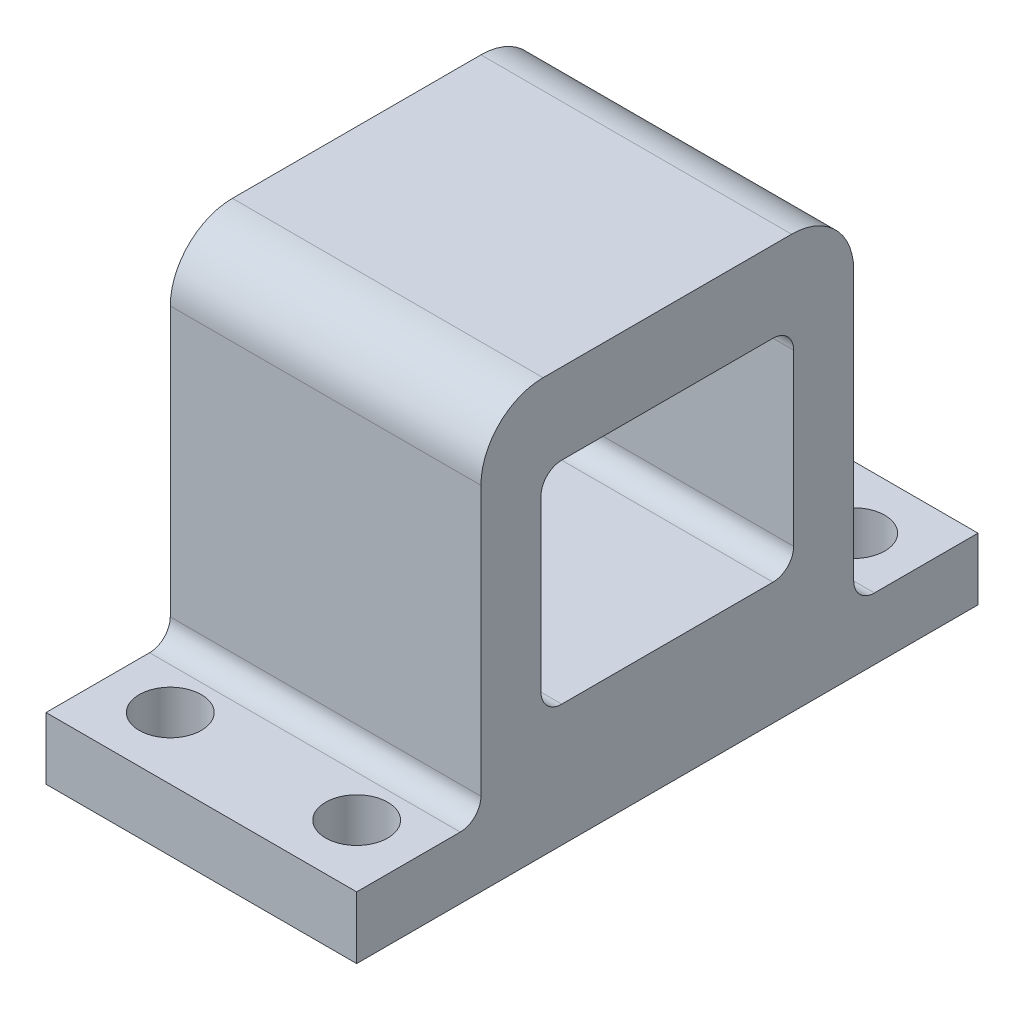
ISO-10303-21;
HEADER;
FILE_DESCRIPTION(('STEP AP214'),'2;1');
FILE_NAME('part.step','',(''),(''),'','','');
FILE_SCHEMA(('AUTOMOTIVE_DESIGN { 1 0 10303 214 1 1 1 1 }'));
ENDSEC;
DATA;
#1=APPLICATION_CONTEXT('core data for automotive mechanical design processes');
#2=APPLICATION_PROTOCOL_DEFINITION('international standard','automotive_design',2000,#1);
#3=PRODUCT_CONTEXT('',#1,'mechanical');
#4=PRODUCT('Part','Part','',(#3));
#5=PRODUCT_RELATED_PRODUCT_CATEGORY('part','',(#4));
#6=PRODUCT_DEFINITION_FORMATION('','',#4);
#7=PRODUCT_DEFINITION_CONTEXT('part definition',#1,'design');
#8=PRODUCT_DEFINITION('design','',#6,#7);
#9=PRODUCT_DEFINITION_SHAPE('','',#8);
#10=(LENGTH_UNIT() NAMED_UNIT(*) SI_UNIT(.MILLI.,.METRE.));
#11=(NAMED_UNIT(*) PLANE_ANGLE_UNIT() SI_UNIT($,.RADIAN.));
#12=(NAMED_UNIT(*) SI_UNIT($,.STERADIAN.) SOLID_ANGLE_UNIT());
#13=UNCERTAINTY_MEASURE_WITH_UNIT(LENGTH_MEASURE(1.E-05),#10,'distance_accuracy_value','');
#14=(GEOMETRIC_REPRESENTATION_CONTEXT(3) GLOBAL_UNCERTAINTY_ASSIGNED_CONTEXT((#13)) GLOBAL_UNIT_ASSIGNED_CONTEXT((#10,
#11,#12)) REPRESENTATION_CONTEXT('',''));
#15=CARTESIAN_POINT('',(0.,0.,0.));
#16=DIRECTION('',(0.,0.,1.));
#17=DIRECTION('',(1.,0.,0.));
#18=AXIS2_PLACEMENT_3D('',#15,#16,#17);
#19=CARTESIAN_POINT('',(0.,3.,0.));
#20=DIRECTION('',(0.,1.,0.));
#21=DIRECTION('',(0.,0.,1.));
#22=AXIS2_PLACEMENT_3D('',#19,#20,#21);
#23=PLANE('',#22);
#24=CARTESIAN_POINT('',(-12.,3.,-27.));
#25=DIRECTION('',(0.,1.,0.));
#26=DIRECTION('',(0.,0.,1.));
#27=AXIS2_PLACEMENT_3D('',#24,#25,#26);
#28=CIRCLE('',#27,1.5);
#29=CARTESIAN_POINT('',(-12.,3.,-25.5));
#30=VERTEX_POINT('',#29);
#31=EDGE_CURVE('E316',#30,#30,#28,.T.);
#32=ORIENTED_EDGE('',*,*,#31,.F.);
#33=EDGE_LOOP('',(#32));
#34=FACE_BOUND('',#33,.T.);
#35=CARTESIAN_POINT('',(-3.,3.,-27.));
#36=DIRECTION('',(0.,1.,0.));
#37=DIRECTION('',(0.,0.,1.));
#38=AXIS2_PLACEMENT_3D('',#35,#36,#37);
#39=CIRCLE('',#38,1.5);
#40=CARTESIAN_POINT('',(-3.,3.,-25.5));
#41=VERTEX_POINT('',#40);
#42=EDGE_CURVE('E317',#41,#41,#39,.T.);
#43=ORIENTED_EDGE('',*,*,#42,.F.);
#44=EDGE_LOOP('',(#43));
#45=FACE_BOUND('',#44,.T.);
#46=DIRECTION('',(0.,0.,1.));
#47=VECTOR('',#46,1.);
#48=CARTESIAN_POINT('',(-15.,3.,0.));
#49=LINE('',#48,#47);
#50=CARTESIAN_POINT('',(-15.,3.,-30.));
#51=VERTEX_POINT('',#50);
#52=CARTESIAN_POINT('',(-15.,3.,-25.));
#53=VERTEX_POINT('',#52);
#54=EDGE_CURVE('E337',#51,#53,#49,.T.);
#55=ORIENTED_EDGE('',*,*,#54,.T.);
#56=DIRECTION('',(1.,0.,0.));
#57=VECTOR('',#56,1.);
#58=CARTESIAN_POINT('',(0.,3.,-25.));
#59=LINE('',#58,#57);
#60=CARTESIAN_POINT('',(0.,3.,-25.));
#61=VERTEX_POINT('',#60);
#62=EDGE_CURVE('E180',#53,#61,#59,.T.);
#63=ORIENTED_EDGE('',*,*,#62,.T.);
#64=DIRECTION('',(0.,0.,-1.));
#65=VECTOR('',#64,1.);
#66=CARTESIAN_POINT('',(0.,3.,0.));
#67=LINE('',#66,#65);
#68=CARTESIAN_POINT('',(0.,3.,-30.));
#69=VERTEX_POINT('',#68);
#70=EDGE_CURVE('E174',#61,#69,#67,.T.);
#71=ORIENTED_EDGE('',*,*,#70,.T.);
#72=DIRECTION('',(-1.,0.,0.));
#73=VECTOR('',#72,1.);
#74=CARTESIAN_POINT('',(0.,3.,-30.));
#75=LINE('',#74,#73);
#76=EDGE_CURVE('E177',#69,#51,#75,.T.);
#77=ORIENTED_EDGE('',*,*,#76,.T.);
#78=EDGE_LOOP('',(#55,#63,#71,#77));
#79=FACE_BOUND('',#78,.T.);
#80=ADVANCED_FACE('F37',(#34,#45,#79),#23,.T.);
#81=CARTESIAN_POINT('',(0.,3.,0.));
#82=DIRECTION('',(-1.,0.,0.));
#83=DIRECTION('',(0.,0.,1.));
#84=AXIS2_PLACEMENT_3D('',#81,#82,#83);
#85=PLANE('',#84);
#86=DIRECTION('',(0.,0.,-1.));
#87=VECTOR('',#86,1.);
#88=CARTESIAN_POINT('',(0.,16.1,-8.9));
#89=LINE('',#88,#87);
#90=CARTESIAN_POINT('',(0.,16.1,-9.9));
#91=VERTEX_POINT('',#90);
#92=CARTESIAN_POINT('',(0.,16.1,-20.1));
#93=VERTEX_POINT('',#92);
#94=EDGE_CURVE('E288',#91,#93,#89,.T.);
#95=ORIENTED_EDGE('',*,*,#94,.T.);
#96=CARTESIAN_POINT('',(0.,15.1,-20.1));
#97=DIRECTION('',(-1.,0.,0.));
#98=DIRECTION('',(0.,0.,1.));
#99=AXIS2_PLACEMENT_3D('',#96,#97,#98);
#100=CIRCLE('',#99,1.);
#101=CARTESIAN_POINT('',(0.,15.1,-21.1));
#102=VERTEX_POINT('',#101);
#103=EDGE_CURVE('E269',#93,#102,#100,.T.);
#104=ORIENTED_EDGE('',*,*,#103,.T.);
#105=DIRECTION('',(0.,-1.,0.));
#106=VECTOR('',#105,1.);
#107=CARTESIAN_POINT('',(0.,16.1,-21.1));
#108=LINE('',#107,#106);
#109=CARTESIAN_POINT('',(0.,6.9,-21.1));
#110=VERTEX_POINT('',#109);
#111=EDGE_CURVE('E281',#102,#110,#108,.T.);
#112=ORIENTED_EDGE('',*,*,#111,.T.);
#113=CARTESIAN_POINT('',(0.,6.9,-20.1));
#114=DIRECTION('',(-1.,0.,0.));
#115=DIRECTION('',(0.,0.,1.));
#116=AXIS2_PLACEMENT_3D('',#113,#114,#115);
#117=CIRCLE('',#116,1.);
#118=CARTESIAN_POINT('',(0.,5.9,-20.1));
#119=VERTEX_POINT('',#118);
#120=EDGE_CURVE('E45',#110,#119,#117,.T.);
#121=ORIENTED_EDGE('',*,*,#120,.T.);
#122=DIRECTION('',(0.,0.,-1.));
#123=VECTOR('',#122,1.);
#124=CARTESIAN_POINT('',(0.,5.9,-8.9));
#125=LINE('',#124,#123);
#126=CARTESIAN_POINT('',(0.,5.9,-9.9));
#127=VERTEX_POINT('',#126);
#128=EDGE_CURVE('E289',#127,#119,#125,.T.);
#129=ORIENTED_EDGE('',*,*,#128,.F.);
#130=CARTESIAN_POINT('',(0.,6.9,-9.9));
#131=DIRECTION('',(-1.,0.,0.));
#132=DIRECTION('',(0.,0.,1.));
#133=AXIS2_PLACEMENT_3D('',#130,#131,#132);
#134=CIRCLE('',#133,1.);
#135=CARTESIAN_POINT('',(0.,6.9,-8.9));
#136=VERTEX_POINT('',#135);
#137=EDGE_CURVE('E250',#127,#136,#134,.T.);
#138=ORIENTED_EDGE('',*,*,#137,.T.);
#139=DIRECTION('',(0.,-1.,0.));
#140=VECTOR('',#139,1.);
#141=CARTESIAN_POINT('',(0.,16.1,-8.9));
#142=LINE('',#141,#140);
#143=CARTESIAN_POINT('',(0.,15.1,-8.9));
#144=VERTEX_POINT('',#143);
#145=EDGE_CURVE('E291',#144,#136,#142,.T.);
#146=ORIENTED_EDGE('',*,*,#145,.F.);
#147=CARTESIAN_POINT('',(0.,15.1,-9.9));
#148=DIRECTION('',(-1.,0.,0.));
#149=DIRECTION('',(0.,0.,1.));
#150=AXIS2_PLACEMENT_3D('',#147,#148,#149);
#151=CIRCLE('',#150,1.);
#152=EDGE_CURVE('E260',#144,#91,#151,.T.);
#153=ORIENTED_EDGE('',*,*,#152,.T.);
#154=EDGE_LOOP('',(#95,#104,#112,#121,#129,#138,#146,#153));
#155=FACE_BOUND('',#154,.T.);
#156=DIRECTION('',(0.,0.,-1.));
#157=VECTOR('',#156,1.);
#158=CARTESIAN_POINT('',(0.,20.,0.));
#159=LINE('',#158,#157);
#160=CARTESIAN_POINT('',(0.,20.,-9.));
#161=VERTEX_POINT('',#160);
#162=CARTESIAN_POINT('',(0.,20.,-21.));
#163=VERTEX_POINT('',#162);
#164=EDGE_CURVE('E301',#161,#163,#159,.T.);
#165=ORIENTED_EDGE('',*,*,#164,.F.);
#166=CARTESIAN_POINT('',(0.,17.,-9.));
#167=DIRECTION('',(-1.,0.,0.));
#168=DIRECTION('',(0.,0.,1.));
#169=AXIS2_PLACEMENT_3D('',#166,#167,#168);
#170=CIRCLE('',#169,3.);
#171=CARTESIAN_POINT('',(0.,17.,-6.));
#172=VERTEX_POINT('',#171);
#173=EDGE_CURVE('E238',#161,#172,#170,.F.);
#174=ORIENTED_EDGE('',*,*,#173,.T.);
#175=DIRECTION('',(0.,-1.,0.));
#176=VECTOR('',#175,1.);
#177=CARTESIAN_POINT('',(0.,20.,-6.));
#178=LINE('',#177,#176);
#179=CARTESIAN_POINT('',(0.,4.,-6.));
#180=VERTEX_POINT('',#179);
#181=EDGE_CURVE('E306',#172,#180,#178,.T.);
#182=ORIENTED_EDGE('',*,*,#181,.T.);
#183=CARTESIAN_POINT('',(0.,4.,-5.));
#184=DIRECTION('',(-1.,0.,0.));
#185=DIRECTION('',(0.,0.,1.));
#186=AXIS2_PLACEMENT_3D('',#183,#184,#185);
#187=CIRCLE('',#186,1.);
#188=CARTESIAN_POINT('',(0.,3.,-5.));
#189=VERTEX_POINT('',#188);
#190=EDGE_CURVE('E212',#180,#189,#187,.T.);
#191=ORIENTED_EDGE('',*,*,#190,.T.);
#192=CARTESIAN_POINT('',(0.,3.,0.));
#193=VERTEX_POINT('',#192);
#194=EDGE_CURVE('E184',#193,#189,#67,.T.);
#195=ORIENTED_EDGE('',*,*,#194,.F.);
#196=DIRECTION('',(0.,-1.,0.));
#197=VECTOR('',#196,1.);
#198=CARTESIAN_POINT('',(0.,3.,0.));
#199=LINE('',#198,#197);
#200=CARTESIAN_POINT('',(0.,0.,0.));
#201=VERTEX_POINT('',#200);
#202=EDGE_CURVE('E341',#193,#201,#199,.T.);
#203=ORIENTED_EDGE('',*,*,#202,.T.);
#204=DIRECTION('',(0.,0.,-1.));
#205=VECTOR('',#204,1.);
#206=CARTESIAN_POINT('',(0.,0.,0.));
#207=LINE('',#206,#205);
#208=CARTESIAN_POINT('',(0.,0.,-30.));
#209=VERTEX_POINT('',#208);
#210=EDGE_CURVE('E201',#201,#209,#207,.T.);
#211=ORIENTED_EDGE('',*,*,#210,.T.);
#212=DIRECTION('',(0.,-1.,0.));
#213=VECTOR('',#212,1.);
#214=CARTESIAN_POINT('',(0.,3.,-30.));
#215=LINE('',#214,#213);
#216=EDGE_CURVE('E190',#69,#209,#215,.T.);
#217=ORIENTED_EDGE('',*,*,#216,.F.);
#218=ORIENTED_EDGE('',*,*,#70,.F.);
#219=CARTESIAN_POINT('',(0.,4.,-25.));
#220=DIRECTION('',(-1.,0.,0.));
#221=DIRECTION('',(0.,0.,1.));
#222=AXIS2_PLACEMENT_3D('',#219,#220,#221);
#223=CIRCLE('',#222,1.);
#224=CARTESIAN_POINT('',(0.,4.,-24.));
#225=VERTEX_POINT('',#224);
#226=EDGE_CURVE('E221',#61,#225,#223,.T.);
#227=ORIENTED_EDGE('',*,*,#226,.T.);
#228=DIRECTION('',(0.,-1.,0.));
#229=VECTOR('',#228,1.);
#230=CARTESIAN_POINT('',(0.,20.,-24.));
#231=LINE('',#230,#229);
#232=CARTESIAN_POINT('',(0.,17.,-24.));
#233=VERTEX_POINT('',#232);
#234=EDGE_CURVE('E304',#233,#225,#231,.T.);
#235=ORIENTED_EDGE('',*,*,#234,.F.);
#236=CARTESIAN_POINT('',(0.,17.,-21.));
#237=DIRECTION('',(-1.,0.,0.));
#238=DIRECTION('',(0.,0.,1.));
#239=AXIS2_PLACEMENT_3D('',#236,#237,#238);
#240=CIRCLE('',#239,3.);
#241=EDGE_CURVE('E228',#233,#163,#240,.F.);
#242=ORIENTED_EDGE('',*,*,#241,.T.);
#243=EDGE_LOOP('',(#165,#174,#182,#191,#195,#203,#211,#217,#218,#227,#235,#242));
#244=FACE_BOUND('',#243,.T.);
#245=ADVANCED_FACE('F198',(#155,#244),#85,.F.);
#246=CARTESIAN_POINT('',(0.,3.,-30.));
#247=DIRECTION('',(0.,0.,1.));
#248=DIRECTION('',(1.,0.,0.));
#249=AXIS2_PLACEMENT_3D('',#246,#247,#248);
#250=PLANE('',#249);
#251=DIRECTION('',(-1.,0.,0.));
#252=VECTOR('',#251,1.);
#253=CARTESIAN_POINT('',(0.,0.,-30.));
#254=LINE('',#253,#252);
#255=CARTESIAN_POINT('',(-15.,0.,-30.));
#256=VERTEX_POINT('',#255);
#257=EDGE_CURVE('E343',#209,#256,#254,.T.);
#258=ORIENTED_EDGE('',*,*,#257,.T.);
#259=DIRECTION('',(0.,-1.,0.));
#260=VECTOR('',#259,1.);
#261=CARTESIAN_POINT('',(-15.,3.,-30.));
#262=LINE('',#261,#260);
#263=EDGE_CURVE('E193',#51,#256,#262,.T.);
#264=ORIENTED_EDGE('',*,*,#263,.F.);
#265=ORIENTED_EDGE('',*,*,#76,.F.);
#266=ORIENTED_EDGE('',*,*,#216,.T.);
#267=EDGE_LOOP('',(#258,#264,#265,#266));
#268=FACE_BOUND('',#267,.T.);
#269=ADVANCED_FACE('F189',(#268),#250,.F.);
#270=CARTESIAN_POINT('',(-15.,3.,0.));
#271=DIRECTION('',(1.,0.,0.));
#272=DIRECTION('',(0.,0.,-1.));
#273=AXIS2_PLACEMENT_3D('',#270,#271,#272);
#274=PLANE('',#273);
#275=DIRECTION('',(0.,0.,-1.));
#276=VECTOR('',#275,1.);
#277=CARTESIAN_POINT('',(-15.,16.1,-8.9));
#278=LINE('',#277,#276);
#279=CARTESIAN_POINT('',(-15.,16.1,-9.9));
#280=VERTEX_POINT('',#279);
#281=CARTESIAN_POINT('',(-15.,16.1,-20.1));
#282=VERTEX_POINT('',#281);
#283=EDGE_CURVE('E464',#280,#282,#278,.T.);
#284=ORIENTED_EDGE('',*,*,#283,.F.);
#285=CARTESIAN_POINT('',(-15.,15.1,-9.9));
#286=DIRECTION('',(1.,0.,0.));
#287=DIRECTION('',(0.,0.,-1.));
#288=AXIS2_PLACEMENT_3D('',#285,#286,#287);
#289=CIRCLE('',#288,1.);
#290=CARTESIAN_POINT('',(-15.,15.1,-8.9));
#291=VERTEX_POINT('',#290);
#292=EDGE_CURVE('E262',#280,#291,#289,.T.);
#293=ORIENTED_EDGE('',*,*,#292,.T.);
#294=DIRECTION('',(0.,-1.,0.));
#295=VECTOR('',#294,1.);
#296=CARTESIAN_POINT('',(-15.,16.1,-8.9));
#297=LINE('',#296,#295);
#298=CARTESIAN_POINT('',(-15.,6.9,-8.9));
#299=VERTEX_POINT('',#298);
#300=EDGE_CURVE('E302',#291,#299,#297,.T.);
#301=ORIENTED_EDGE('',*,*,#300,.T.);
#302=CARTESIAN_POINT('',(-15.,6.9,-9.9));
#303=DIRECTION('',(1.,0.,0.));
#304=DIRECTION('',(0.,0.,-1.));
#305=AXIS2_PLACEMENT_3D('',#302,#303,#304);
#306=CIRCLE('',#305,1.);
#307=CARTESIAN_POINT('',(-15.,5.9,-9.9));
#308=VERTEX_POINT('',#307);
#309=EDGE_CURVE('E253',#299,#308,#306,.T.);
#310=ORIENTED_EDGE('',*,*,#309,.T.);
#311=DIRECTION('',(0.,0.,-1.));
#312=VECTOR('',#311,1.);
#313=CARTESIAN_POINT('',(-15.,5.9,-8.9));
#314=LINE('',#313,#312);
#315=CARTESIAN_POINT('',(-15.,5.9,-20.1));
#316=VERTEX_POINT('',#315);
#317=EDGE_CURVE('E297',#308,#316,#314,.T.);
#318=ORIENTED_EDGE('',*,*,#317,.T.);
#319=CARTESIAN_POINT('',(-15.,6.9,-20.1));
#320=DIRECTION('',(1.,0.,0.));
#321=DIRECTION('',(0.,0.,-1.));
#322=AXIS2_PLACEMENT_3D('',#319,#320,#321);
#323=CIRCLE('',#322,1.);
#324=CARTESIAN_POINT('',(-15.,6.9,-21.1));
#325=VERTEX_POINT('',#324);
#326=EDGE_CURVE('E11',#316,#325,#323,.T.);
#327=ORIENTED_EDGE('',*,*,#326,.T.);
#328=DIRECTION('',(0.,-1.,0.));
#329=VECTOR('',#328,1.);
#330=CARTESIAN_POINT('',(-15.,16.1,-21.1));
#331=LINE('',#330,#329);
#332=CARTESIAN_POINT('',(-15.,15.1,-21.1));
#333=VERTEX_POINT('',#332);
#334=EDGE_CURVE('E284',#333,#325,#331,.T.);
#335=ORIENTED_EDGE('',*,*,#334,.F.);
#336=CARTESIAN_POINT('',(-15.,15.1,-20.1));
#337=DIRECTION('',(1.,0.,0.));
#338=DIRECTION('',(0.,0.,-1.));
#339=AXIS2_PLACEMENT_3D('',#336,#337,#338);
#340=CIRCLE('',#339,1.);
#341=EDGE_CURVE('E271',#333,#282,#340,.T.);
#342=ORIENTED_EDGE('',*,*,#341,.T.);
#343=EDGE_LOOP('',(#284,#293,#301,#310,#318,#327,#335,#342));
#344=FACE_BOUND('',#343,.T.);
#345=DIRECTION('',(0.,-1.,0.));
#346=VECTOR('',#345,1.);
#347=CARTESIAN_POINT('',(-15.,20.,-6.));
#348=LINE('',#347,#346);
#349=CARTESIAN_POINT('',(-15.,17.,-6.));
#350=VERTEX_POINT('',#349);
#351=CARTESIAN_POINT('',(-15.,4.,-6.));
#352=VERTEX_POINT('',#351);
#353=EDGE_CURVE('E308',#350,#352,#348,.T.);
#354=ORIENTED_EDGE('',*,*,#353,.F.);
#355=CARTESIAN_POINT('',(-15.,17.,-9.));
#356=DIRECTION('',(1.,0.,0.));
#357=DIRECTION('',(0.,0.,-1.));
#358=AXIS2_PLACEMENT_3D('',#355,#356,#357);
#359=CIRCLE('',#358,3.);
#360=CARTESIAN_POINT('',(-15.,20.,-9.));
#361=VERTEX_POINT('',#360);
#362=EDGE_CURVE('E242',#350,#361,#359,.F.);
#363=ORIENTED_EDGE('',*,*,#362,.T.);
#364=DIRECTION('',(0.,0.,1.));
#365=VECTOR('',#364,1.);
#366=CARTESIAN_POINT('',(-15.,20.,0.));
#367=LINE('',#366,#365);
#368=CARTESIAN_POINT('',(-15.,20.,-21.));
#369=VERTEX_POINT('',#368);
#370=EDGE_CURVE('E298',#369,#361,#367,.T.);
#371=ORIENTED_EDGE('',*,*,#370,.F.);
#372=CARTESIAN_POINT('',(-15.,17.,-21.));
#373=DIRECTION('',(1.,0.,0.));
#374=DIRECTION('',(0.,0.,-1.));
#375=AXIS2_PLACEMENT_3D('',#372,#373,#374);
#376=CIRCLE('',#375,3.);
#377=CARTESIAN_POINT('',(-15.,17.,-24.));
#378=VERTEX_POINT('',#377);
#379=EDGE_CURVE('E233',#369,#378,#376,.F.);
#380=ORIENTED_EDGE('',*,*,#379,.T.);
#381=DIRECTION('',(0.,-1.,0.));
#382=VECTOR('',#381,1.);
#383=CARTESIAN_POINT('',(-15.,20.,-24.));
#384=LINE('',#383,#382);
#385=CARTESIAN_POINT('',(-15.,4.,-24.));
#386=VERTEX_POINT('',#385);
#387=EDGE_CURVE('E310',#378,#386,#384,.T.);
#388=ORIENTED_EDGE('',*,*,#387,.T.);
#389=CARTESIAN_POINT('',(-15.,4.,-25.));
#390=DIRECTION('',(1.,0.,0.));
#391=DIRECTION('',(0.,0.,-1.));
#392=AXIS2_PLACEMENT_3D('',#389,#390,#391);
#393=CIRCLE('',#392,1.);
#394=EDGE_CURVE('E223',#386,#53,#393,.T.);
#395=ORIENTED_EDGE('',*,*,#394,.T.);
#396=ORIENTED_EDGE('',*,*,#54,.F.);
#397=ORIENTED_EDGE('',*,*,#263,.T.);
#398=DIRECTION('',(0.,0.,1.));
#399=VECTOR('',#398,1.);
#400=CARTESIAN_POINT('',(-15.,0.,0.));
#401=LINE('',#400,#399);
#402=CARTESIAN_POINT('',(-15.,0.,0.));
#403=VERTEX_POINT('',#402);
#404=EDGE_CURVE('E345',#256,#403,#401,.T.);
#405=ORIENTED_EDGE('',*,*,#404,.T.);
#406=DIRECTION('',(0.,-1.,0.));
#407=VECTOR('',#406,1.);
#408=CARTESIAN_POINT('',(-15.,3.,0.));
#409=LINE('',#408,#407);
#410=CARTESIAN_POINT('',(-15.,3.,0.));
#411=VERTEX_POINT('',#410);
#412=EDGE_CURVE('E207',#411,#403,#409,.T.);
#413=ORIENTED_EDGE('',*,*,#412,.F.);
#414=CARTESIAN_POINT('',(-15.,3.,-5.));
#415=VERTEX_POINT('',#414);
#416=EDGE_CURVE('E195',#415,#411,#49,.T.);
#417=ORIENTED_EDGE('',*,*,#416,.F.);
#418=CARTESIAN_POINT('',(-15.,4.,-5.));
#419=DIRECTION('',(1.,0.,0.));
#420=DIRECTION('',(0.,0.,-1.));
#421=AXIS2_PLACEMENT_3D('',#418,#419,#420);
#422=CIRCLE('',#421,1.);
#423=EDGE_CURVE('E214',#415,#352,#422,.T.);
#424=ORIENTED_EDGE('',*,*,#423,.T.);
#425=EDGE_LOOP('',(#354,#363,#371,#380,#388,#395,#396,#397,#405,#413,#417,#424));
#426=FACE_BOUND('',#425,.T.);
#427=ADVANCED_FACE('F361',(#344,#426),#274,.F.);
#428=CARTESIAN_POINT('',(0.,3.,0.));
#429=DIRECTION('',(0.,0.,-1.));
#430=DIRECTION('',(-1.,0.,0.));
#431=AXIS2_PLACEMENT_3D('',#428,#429,#430);
#432=PLANE('',#431);
#433=DIRECTION('',(1.,0.,0.));
#434=VECTOR('',#433,1.);
#435=CARTESIAN_POINT('',(0.,0.,0.));
#436=LINE('',#435,#434);
#437=EDGE_CURVE('E185',#403,#201,#436,.T.);
#438=ORIENTED_EDGE('',*,*,#437,.T.);
#439=ORIENTED_EDGE('',*,*,#202,.F.);
#440=DIRECTION('',(1.,0.,0.));
#441=VECTOR('',#440,1.);
#442=CARTESIAN_POINT('',(0.,3.,0.));
#443=LINE('',#442,#441);
#444=EDGE_CURVE('E339',#411,#193,#443,.T.);
#445=ORIENTED_EDGE('',*,*,#444,.F.);
#446=ORIENTED_EDGE('',*,*,#412,.T.);
#447=EDGE_LOOP('',(#438,#439,#445,#446));
#448=FACE_BOUND('',#447,.T.);
#449=ADVANCED_FACE('F353',(#448),#432,.F.);
#450=ORIENTED_EDGE('',*,*,#194,.T.);
#451=DIRECTION('',(1.,0.,0.));
#452=VECTOR('',#451,1.);
#453=CARTESIAN_POINT('',(0.,3.,-5.));
#454=LINE('',#453,#452);
#455=EDGE_CURVE('E205',#189,#415,#454,.F.);
#456=ORIENTED_EDGE('',*,*,#455,.T.);
#457=ORIENTED_EDGE('',*,*,#416,.T.);
#458=ORIENTED_EDGE('',*,*,#444,.T.);
#459=EDGE_LOOP('',(#450,#456,#457,#458));
#460=FACE_BOUND('',#459,.T.);
#461=CARTESIAN_POINT('',(-12.,3.,-3.));
#462=DIRECTION('',(0.,1.,0.));
#463=DIRECTION('',(0.,0.,1.));
#464=AXIS2_PLACEMENT_3D('',#461,#462,#463);
#465=CIRCLE('',#464,1.5);
#466=CARTESIAN_POINT('',(-12.,3.,-1.5));
#467=VERTEX_POINT('',#466);
#468=EDGE_CURVE('E312',#467,#467,#465,.T.);
#469=ORIENTED_EDGE('',*,*,#468,.F.);
#470=EDGE_LOOP('',(#469));
#471=FACE_BOUND('',#470,.T.);
#472=CARTESIAN_POINT('',(-3.,3.,-3.));
#473=DIRECTION('',(0.,1.,0.));
#474=DIRECTION('',(0.,0.,1.));
#475=AXIS2_PLACEMENT_3D('',#472,#473,#474);
#476=CIRCLE('',#475,1.5);
#477=CARTESIAN_POINT('',(-3.,3.,-1.5));
#478=VERTEX_POINT('',#477);
#479=EDGE_CURVE('E323',#478,#478,#476,.T.);
#480=ORIENTED_EDGE('',*,*,#479,.F.);
#481=EDGE_LOOP('',(#480));
#482=FACE_BOUND('',#481,.T.);
#483=ADVANCED_FACE('F394',(#460,#471,#482),#23,.T.);
#484=CARTESIAN_POINT('',(0.,0.,0.));
#485=DIRECTION('',(0.,1.,0.));
#486=DIRECTION('',(0.,0.,1.));
#487=AXIS2_PLACEMENT_3D('',#484,#485,#486);
#488=PLANE('',#487);
#489=CARTESIAN_POINT('',(-12.,0.,-3.));
#490=DIRECTION('',(0.,1.,0.));
#491=DIRECTION('',(0.,0.,1.));
#492=AXIS2_PLACEMENT_3D('',#489,#490,#491);
#493=CIRCLE('',#492,1.5);
#494=CARTESIAN_POINT('',(-12.,0.,-1.5));
#495=VERTEX_POINT('',#494);
#496=EDGE_CURVE('E326',#495,#495,#493,.T.);
#497=ORIENTED_EDGE('',*,*,#496,.T.);
#498=EDGE_LOOP('',(#497));
#499=FACE_BOUND('',#498,.T.);
#500=CARTESIAN_POINT('',(-3.,0.,-3.));
#501=DIRECTION('',(0.,1.,0.));
#502=DIRECTION('',(0.,0.,1.));
#503=AXIS2_PLACEMENT_3D('',#500,#501,#502);
#504=CIRCLE('',#503,1.5);
#505=CARTESIAN_POINT('',(-3.,0.,-1.5));
#506=VERTEX_POINT('',#505);
#507=EDGE_CURVE('E320',#506,#506,#504,.T.);
#508=ORIENTED_EDGE('',*,*,#507,.T.);
#509=EDGE_LOOP('',(#508));
#510=FACE_BOUND('',#509,.T.);
#511=CARTESIAN_POINT('',(-3.,0.,-27.));
#512=DIRECTION('',(0.,1.,0.));
#513=DIRECTION('',(0.,0.,1.));
#514=AXIS2_PLACEMENT_3D('',#511,#512,#513);
#515=CIRCLE('',#514,1.5);
#516=CARTESIAN_POINT('',(-3.,0.,-25.5));
#517=VERTEX_POINT('',#516);
#518=EDGE_CURVE('E313',#517,#517,#515,.T.);
#519=ORIENTED_EDGE('',*,*,#518,.T.);
#520=EDGE_LOOP('',(#519));
#521=FACE_BOUND('',#520,.T.);
#522=CARTESIAN_POINT('',(-12.,0.,-27.));
#523=DIRECTION('',(0.,1.,0.));
#524=DIRECTION('',(0.,0.,1.));
#525=AXIS2_PLACEMENT_3D('',#522,#523,#524);
#526=CIRCLE('',#525,1.5);
#527=CARTESIAN_POINT('',(-12.,0.,-25.5));
#528=VERTEX_POINT('',#527);
#529=EDGE_CURVE('E331',#528,#528,#526,.T.);
#530=ORIENTED_EDGE('',*,*,#529,.T.);
#531=EDGE_LOOP('',(#530));
#532=FACE_BOUND('',#531,.T.);
#533=ORIENTED_EDGE('',*,*,#210,.F.);
#534=ORIENTED_EDGE('',*,*,#437,.F.);
#535=ORIENTED_EDGE('',*,*,#404,.F.);
#536=ORIENTED_EDGE('',*,*,#257,.F.);
#537=EDGE_LOOP('',(#533,#534,#535,#536));
#538=FACE_BOUND('',#537,.T.);
#539=ADVANCED_FACE('F359',(#499,#510,#521,#532,#538),#488,.F.);
#540=CARTESIAN_POINT('',(-12.,0.,-27.));
#541=DIRECTION('',(0.,1.,0.));
#542=DIRECTION('',(0.,0.,1.));
#543=AXIS2_PLACEMENT_3D('',#540,#541,#542);
#544=CYLINDRICAL_SURFACE('',#543,1.5);
#545=ORIENTED_EDGE('',*,*,#529,.F.);
#546=EDGE_LOOP('',(#545));
#547=FACE_BOUND('',#546,.T.);
#548=ORIENTED_EDGE('',*,*,#31,.T.);
#549=EDGE_LOOP('',(#548));
#550=FACE_BOUND('',#549,.T.);
#551=ADVANCED_FACE('F414',(#547,#550),#544,.F.);
#552=CARTESIAN_POINT('',(-3.,0.,-27.));
#553=DIRECTION('',(0.,1.,0.));
#554=DIRECTION('',(0.,0.,1.));
#555=AXIS2_PLACEMENT_3D('',#552,#553,#554);
#556=CYLINDRICAL_SURFACE('',#555,1.5);
#557=ORIENTED_EDGE('',*,*,#518,.F.);
#558=EDGE_LOOP('',(#557));
#559=FACE_BOUND('',#558,.T.);
#560=ORIENTED_EDGE('',*,*,#42,.T.);
#561=EDGE_LOOP('',(#560));
#562=FACE_BOUND('',#561,.T.);
#563=ADVANCED_FACE('F405',(#559,#562),#556,.F.);
#564=CARTESIAN_POINT('',(-3.,0.,-3.));
#565=DIRECTION('',(0.,1.,0.));
#566=DIRECTION('',(0.,0.,1.));
#567=AXIS2_PLACEMENT_3D('',#564,#565,#566);
#568=CYLINDRICAL_SURFACE('',#567,1.5);
#569=ORIENTED_EDGE('',*,*,#507,.F.);
#570=EDGE_LOOP('',(#569));
#571=FACE_BOUND('',#570,.T.);
#572=ORIENTED_EDGE('',*,*,#479,.T.);
#573=EDGE_LOOP('',(#572));
#574=FACE_BOUND('',#573,.T.);
#575=ADVANCED_FACE('F402',(#571,#574),#568,.F.);
#576=CARTESIAN_POINT('',(-12.,0.,-3.));
#577=DIRECTION('',(0.,1.,0.));
#578=DIRECTION('',(0.,0.,1.));
#579=AXIS2_PLACEMENT_3D('',#576,#577,#578);
#580=CYLINDRICAL_SURFACE('',#579,1.5);
#581=ORIENTED_EDGE('',*,*,#496,.F.);
#582=EDGE_LOOP('',(#581));
#583=FACE_BOUND('',#582,.T.);
#584=ORIENTED_EDGE('',*,*,#468,.T.);
#585=EDGE_LOOP('',(#584));
#586=FACE_BOUND('',#585,.T.);
#587=ADVANCED_FACE('F404',(#583,#586),#580,.F.);
#588=CARTESIAN_POINT('',(0.,20.,-24.));
#589=DIRECTION('',(0.,0.,-1.));
#590=DIRECTION('',(-1.,0.,0.));
#591=AXIS2_PLACEMENT_3D('',#588,#589,#590);
#592=PLANE('',#591);
#593=ORIENTED_EDGE('',*,*,#387,.F.);
#594=DIRECTION('',(1.,0.,0.));
#595=VECTOR('',#594,1.);
#596=CARTESIAN_POINT('',(0.,17.,-24.));
#597=LINE('',#596,#595);
#598=EDGE_CURVE('E225',#378,#233,#597,.T.);
#599=ORIENTED_EDGE('',*,*,#598,.T.);
#600=ORIENTED_EDGE('',*,*,#234,.T.);
#601=DIRECTION('',(1.,0.,0.));
#602=VECTOR('',#601,1.);
#603=CARTESIAN_POINT('',(-15.,4.,-24.));
#604=LINE('',#603,#602);
#605=EDGE_CURVE('E218',#225,#386,#604,.F.);
#606=ORIENTED_EDGE('',*,*,#605,.T.);
#607=EDGE_LOOP('',(#593,#599,#600,#606));
#608=FACE_BOUND('',#607,.T.);
#609=ADVANCED_FACE('F370',(#608),#592,.T.);
#610=CARTESIAN_POINT('',(0.,20.,-6.));
#611=DIRECTION('',(0.,0.,-1.));
#612=DIRECTION('',(-1.,0.,0.));
#613=AXIS2_PLACEMENT_3D('',#610,#611,#612);
#614=PLANE('',#613);
#615=ORIENTED_EDGE('',*,*,#181,.F.);
#616=DIRECTION('',(1.,0.,0.));
#617=VECTOR('',#616,1.);
#618=CARTESIAN_POINT('',(-15.,17.,-6.));
#619=LINE('',#618,#617);
#620=EDGE_CURVE('E240',#172,#350,#619,.F.);
#621=ORIENTED_EDGE('',*,*,#620,.T.);
#622=ORIENTED_EDGE('',*,*,#353,.T.);
#623=DIRECTION('',(1.,0.,0.));
#624=VECTOR('',#623,1.);
#625=CARTESIAN_POINT('',(0.,4.,-6.));
#626=LINE('',#625,#624);
#627=EDGE_CURVE('E202',#352,#180,#626,.T.);
#628=ORIENTED_EDGE('',*,*,#627,.T.);
#629=EDGE_LOOP('',(#615,#621,#622,#628));
#630=FACE_BOUND('',#629,.T.);
#631=ADVANCED_FACE('F386',(#630),#614,.F.);
#632=CARTESIAN_POINT('',(0.,20.,0.));
#633=DIRECTION('',(0.,1.,0.));
#634=DIRECTION('',(0.,0.,1.));
#635=AXIS2_PLACEMENT_3D('',#632,#633,#634);
#636=PLANE('',#635);
#637=ORIENTED_EDGE('',*,*,#370,.T.);
#638=DIRECTION('',(1.,0.,0.));
#639=VECTOR('',#638,1.);
#640=CARTESIAN_POINT('',(0.,20.,-9.));
#641=LINE('',#640,#639);
#642=EDGE_CURVE('E235',#361,#161,#641,.T.);
#643=ORIENTED_EDGE('',*,*,#642,.T.);
#644=ORIENTED_EDGE('',*,*,#164,.T.);
#645=DIRECTION('',(1.,0.,0.));
#646=VECTOR('',#645,1.);
#647=CARTESIAN_POINT('',(0.,20.,-21.));
#648=LINE('',#647,#646);
#649=EDGE_CURVE('E231',#163,#369,#648,.F.);
#650=ORIENTED_EDGE('',*,*,#649,.T.);
#651=EDGE_LOOP('',(#637,#643,#644,#650));
#652=FACE_BOUND('',#651,.T.);
#653=ADVANCED_FACE('F377',(#652),#636,.T.);
#654=CARTESIAN_POINT('',(0.,4.,-5.));
#655=DIRECTION('',(1.,0.,0.));
#656=DIRECTION('',(0.,0.,-1.));
#657=AXIS2_PLACEMENT_3D('',#654,#655,#656);
#658=CYLINDRICAL_SURFACE('',#657,1.);
#659=ORIENTED_EDGE('',*,*,#423,.F.);
#660=ORIENTED_EDGE('',*,*,#455,.F.);
#661=ORIENTED_EDGE('',*,*,#190,.F.);
#662=ORIENTED_EDGE('',*,*,#627,.F.);
#663=EDGE_LOOP('',(#659,#660,#661,#662));
#664=FACE_BOUND('',#663,.T.);
#665=ADVANCED_FACE('F390',(#664),#658,.F.);
#666=CARTESIAN_POINT('',(0.,4.,-25.));
#667=DIRECTION('',(-1.,0.,0.));
#668=DIRECTION('',(0.,0.,1.));
#669=AXIS2_PLACEMENT_3D('',#666,#667,#668);
#670=CYLINDRICAL_SURFACE('',#669,1.);
#671=ORIENTED_EDGE('',*,*,#394,.F.);
#672=ORIENTED_EDGE('',*,*,#605,.F.);
#673=ORIENTED_EDGE('',*,*,#226,.F.);
#674=ORIENTED_EDGE('',*,*,#62,.F.);
#675=EDGE_LOOP('',(#671,#672,#673,#674));
#676=FACE_BOUND('',#675,.T.);
#677=ADVANCED_FACE('F364',(#676),#670,.F.);
#678=CARTESIAN_POINT('',(-15.,5.9,-8.9));
#679=DIRECTION('',(0.,-1.,0.));
#680=DIRECTION('',(0.,0.,-1.));
#681=AXIS2_PLACEMENT_3D('',#678,#679,#680);
#682=PLANE('',#681);
#683=ORIENTED_EDGE('',*,*,#128,.T.);
#684=DIRECTION('',(1.,0.,0.));
#685=VECTOR('',#684,1.);
#686=CARTESIAN_POINT('',(-15.,5.9,-20.1));
#687=LINE('',#686,#685);
#688=EDGE_CURVE('E58',#119,#316,#687,.F.);
#689=ORIENTED_EDGE('',*,*,#688,.T.);
#690=ORIENTED_EDGE('',*,*,#317,.F.);
#691=DIRECTION('',(1.,0.,0.));
#692=VECTOR('',#691,1.);
#693=CARTESIAN_POINT('',(0.,5.9,-9.9));
#694=LINE('',#693,#692);
#695=EDGE_CURVE('E244',#308,#127,#694,.T.);
#696=ORIENTED_EDGE('',*,*,#695,.T.);
#697=EDGE_LOOP('',(#683,#689,#690,#696));
#698=FACE_BOUND('',#697,.T.);
#699=ADVANCED_FACE('F442',(#698),#682,.F.);
#700=CARTESIAN_POINT('',(-15.,16.1,-8.9));
#701=DIRECTION('',(0.,0.,1.));
#702=DIRECTION('',(1.,0.,0.));
#703=AXIS2_PLACEMENT_3D('',#700,#701,#702);
#704=PLANE('',#703);
#705=ORIENTED_EDGE('',*,*,#300,.F.);
#706=DIRECTION('',(1.,0.,0.));
#707=VECTOR('',#706,1.);
#708=CARTESIAN_POINT('',(-15.,15.1,-8.9));
#709=LINE('',#708,#707);
#710=EDGE_CURVE('E255',#291,#144,#709,.T.);
#711=ORIENTED_EDGE('',*,*,#710,.T.);
#712=ORIENTED_EDGE('',*,*,#145,.T.);
#713=DIRECTION('',(1.,0.,0.));
#714=VECTOR('',#713,1.);
#715=CARTESIAN_POINT('',(-15.,6.9,-8.9));
#716=LINE('',#715,#714);
#717=EDGE_CURVE('E247',#136,#299,#716,.F.);
#718=ORIENTED_EDGE('',*,*,#717,.T.);
#719=EDGE_LOOP('',(#705,#711,#712,#718));
#720=FACE_BOUND('',#719,.T.);
#721=ADVANCED_FACE('F479',(#720),#704,.F.);
#722=CARTESIAN_POINT('',(-15.,16.1,-8.9));
#723=DIRECTION('',(0.,-1.,0.));
#724=DIRECTION('',(0.,0.,-1.));
#725=AXIS2_PLACEMENT_3D('',#722,#723,#724);
#726=PLANE('',#725);
#727=ORIENTED_EDGE('',*,*,#283,.T.);
#728=DIRECTION('',(1.,0.,0.));
#729=VECTOR('',#728,1.);
#730=CARTESIAN_POINT('',(0.,16.1,-20.1));
#731=LINE('',#730,#729);
#732=EDGE_CURVE('E264',#282,#93,#731,.T.);
#733=ORIENTED_EDGE('',*,*,#732,.T.);
#734=ORIENTED_EDGE('',*,*,#94,.F.);
#735=DIRECTION('',(1.,0.,0.));
#736=VECTOR('',#735,1.);
#737=CARTESIAN_POINT('',(-15.,16.1,-9.9));
#738=LINE('',#737,#736);
#739=EDGE_CURVE('E258',#91,#280,#738,.F.);
#740=ORIENTED_EDGE('',*,*,#739,.T.);
#741=EDGE_LOOP('',(#727,#733,#734,#740));
#742=FACE_BOUND('',#741,.T.);
#743=ADVANCED_FACE('F467',(#742),#726,.T.);
#744=CARTESIAN_POINT('',(-15.,16.1,-21.1));
#745=DIRECTION('',(0.,0.,1.));
#746=DIRECTION('',(0.,-1.,0.));
#747=AXIS2_PLACEMENT_3D('',#744,#745,#746);
#748=PLANE('',#747);
#749=ORIENTED_EDGE('',*,*,#334,.T.);
#750=DIRECTION('',(1.,0.,0.));
#751=VECTOR('',#750,1.);
#752=CARTESIAN_POINT('',(-15.,6.9,-21.1));
#753=LINE('',#752,#751);
#754=EDGE_CURVE('E273',#325,#110,#753,.T.);
#755=ORIENTED_EDGE('',*,*,#754,.T.);
#756=ORIENTED_EDGE('',*,*,#111,.F.);
#757=DIRECTION('',(1.,0.,0.));
#758=VECTOR('',#757,1.);
#759=CARTESIAN_POINT('',(-15.,15.1,-21.1));
#760=LINE('',#759,#758);
#761=EDGE_CURVE('E267',#102,#333,#760,.F.);
#762=ORIENTED_EDGE('',*,*,#761,.T.);
#763=EDGE_LOOP('',(#749,#755,#756,#762));
#764=FACE_BOUND('',#763,.T.);
#765=ADVANCED_FACE('F280',(#764),#748,.T.);
#766=CARTESIAN_POINT('',(0.,17.,-21.));
#767=DIRECTION('',(1.,0.,0.));
#768=DIRECTION('',(0.,0.,-1.));
#769=AXIS2_PLACEMENT_3D('',#766,#767,#768);
#770=CYLINDRICAL_SURFACE('',#769,3.);
#771=ORIENTED_EDGE('',*,*,#379,.F.);
#772=ORIENTED_EDGE('',*,*,#649,.F.);
#773=ORIENTED_EDGE('',*,*,#241,.F.);
#774=ORIENTED_EDGE('',*,*,#598,.F.);
#775=EDGE_LOOP('',(#771,#772,#773,#774));
#776=FACE_BOUND('',#775,.T.);
#777=ADVANCED_FACE('F374',(#776),#770,.T.);
#778=CARTESIAN_POINT('',(0.,17.,-9.));
#779=DIRECTION('',(-1.,0.,0.));
#780=DIRECTION('',(0.,0.,1.));
#781=AXIS2_PLACEMENT_3D('',#778,#779,#780);
#782=CYLINDRICAL_SURFACE('',#781,3.);
#783=ORIENTED_EDGE('',*,*,#362,.F.);
#784=ORIENTED_EDGE('',*,*,#620,.F.);
#785=ORIENTED_EDGE('',*,*,#173,.F.);
#786=ORIENTED_EDGE('',*,*,#642,.F.);
#787=EDGE_LOOP('',(#783,#784,#785,#786));
#788=FACE_BOUND('',#787,.T.);
#789=ADVANCED_FACE('F382',(#788),#782,.T.);
#790=CARTESIAN_POINT('',(-15.,6.9,-9.9));
#791=DIRECTION('',(-1.,0.,0.));
#792=DIRECTION('',(0.,0.,1.));
#793=AXIS2_PLACEMENT_3D('',#790,#791,#792);
#794=CYLINDRICAL_SURFACE('',#793,1.);
#795=ORIENTED_EDGE('',*,*,#309,.F.);
#796=ORIENTED_EDGE('',*,*,#717,.F.);
#797=ORIENTED_EDGE('',*,*,#137,.F.);
#798=ORIENTED_EDGE('',*,*,#695,.F.);
#799=EDGE_LOOP('',(#795,#796,#797,#798));
#800=FACE_BOUND('',#799,.T.);
#801=ADVANCED_FACE('F447',(#800),#794,.F.);
#802=CARTESIAN_POINT('',(-15.,15.1,-9.9));
#803=DIRECTION('',(1.,0.,0.));
#804=DIRECTION('',(0.,0.,-1.));
#805=AXIS2_PLACEMENT_3D('',#802,#803,#804);
#806=CYLINDRICAL_SURFACE('',#805,1.);
#807=ORIENTED_EDGE('',*,*,#292,.F.);
#808=ORIENTED_EDGE('',*,*,#739,.F.);
#809=ORIENTED_EDGE('',*,*,#152,.F.);
#810=ORIENTED_EDGE('',*,*,#710,.F.);
#811=EDGE_LOOP('',(#807,#808,#809,#810));
#812=FACE_BOUND('',#811,.T.);
#813=ADVANCED_FACE('F450',(#812),#806,.F.);
#814=CARTESIAN_POINT('',(-15.,15.1,-20.1));
#815=DIRECTION('',(-1.,0.,0.));
#816=DIRECTION('',(0.,0.,1.));
#817=AXIS2_PLACEMENT_3D('',#814,#815,#816);
#818=CYLINDRICAL_SURFACE('',#817,1.);
#819=ORIENTED_EDGE('',*,*,#341,.F.);
#820=ORIENTED_EDGE('',*,*,#761,.F.);
#821=ORIENTED_EDGE('',*,*,#103,.F.);
#822=ORIENTED_EDGE('',*,*,#732,.F.);
#823=EDGE_LOOP('',(#819,#820,#821,#822));
#824=FACE_BOUND('',#823,.T.);
#825=ADVANCED_FACE('F453',(#824),#818,.F.);
#826=CARTESIAN_POINT('',(-15.,6.9,-20.1));
#827=DIRECTION('',(1.,0.,0.));
#828=DIRECTION('',(0.,0.,-1.));
#829=AXIS2_PLACEMENT_3D('',#826,#827,#828);
#830=CYLINDRICAL_SURFACE('',#829,1.);
#831=ORIENTED_EDGE('',*,*,#326,.F.);
#832=ORIENTED_EDGE('',*,*,#688,.F.);
#833=ORIENTED_EDGE('',*,*,#120,.F.);
#834=ORIENTED_EDGE('',*,*,#754,.F.);
#835=EDGE_LOOP('',(#831,#832,#833,#834));
#836=FACE_BOUND('',#835,.T.);
#837=ADVANCED_FACE('F39',(#836),#830,.F.);
#838=CLOSED_SHELL('',(#80,#245,#269,#427,#449,#483,#539,#551,#563,#575,#587,#609,#631,#653,#665,
#677,#699,#721,#743,#765,#777,#789,#801,#813,#825,#837));
#839=MANIFOLD_SOLID_BREP('B2',#838);
#840=ADVANCED_BREP_SHAPE_REPRESENTATION('',(#18,#839),#14);
#841=SHAPE_DEFINITION_REPRESENTATION(#9,#840);
ENDSEC;
END-ISO-10303-21;
